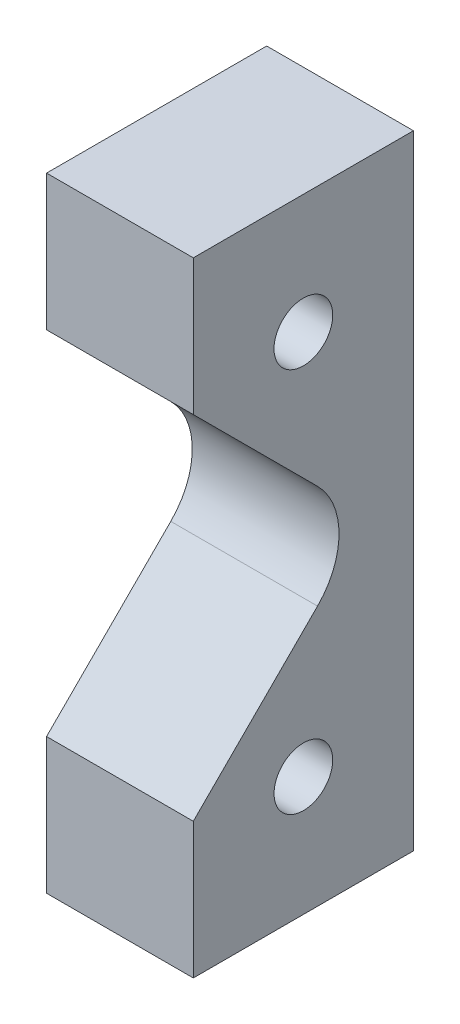
ISO-10303-21;
HEADER;
FILE_DESCRIPTION(('STEP AP214'),'2;1');
FILE_NAME('part.step','',(''),(''),'','','');
FILE_SCHEMA(('AUTOMOTIVE_DESIGN { 1 0 10303 214 1 1 1 1 }'));
ENDSEC;
DATA;
#1=APPLICATION_CONTEXT('core data for automotive mechanical design processes');
#2=APPLICATION_PROTOCOL_DEFINITION('international standard','automotive_design',2000,#1);
#3=PRODUCT_CONTEXT('',#1,'mechanical');
#4=PRODUCT('Part','Part','',(#3));
#5=PRODUCT_RELATED_PRODUCT_CATEGORY('part','',(#4));
#6=PRODUCT_DEFINITION_FORMATION('','',#4);
#7=PRODUCT_DEFINITION_CONTEXT('part definition',#1,'design');
#8=PRODUCT_DEFINITION('design','',#6,#7);
#9=PRODUCT_DEFINITION_SHAPE('','',#8);
#10=(LENGTH_UNIT() NAMED_UNIT(*) SI_UNIT(.MILLI.,.METRE.));
#11=(NAMED_UNIT(*) PLANE_ANGLE_UNIT() SI_UNIT($,.RADIAN.));
#12=(NAMED_UNIT(*) SI_UNIT($,.STERADIAN.) SOLID_ANGLE_UNIT());
#13=UNCERTAINTY_MEASURE_WITH_UNIT(LENGTH_MEASURE(1.E-05),#10,'distance_accuracy_value','');
#14=(GEOMETRIC_REPRESENTATION_CONTEXT(3) GLOBAL_UNCERTAINTY_ASSIGNED_CONTEXT((#13)) GLOBAL_UNIT_ASSIGNED_CONTEXT((#10,
#11,#12)) REPRESENTATION_CONTEXT('',''));
#15=CARTESIAN_POINT('',(0.,0.,0.));
#16=DIRECTION('',(0.,0.,1.));
#17=DIRECTION('',(1.,0.,0.));
#18=AXIS2_PLACEMENT_3D('',#15,#16,#17);
#19=CARTESIAN_POINT('',(20.,24.,15.));
#20=DIRECTION('',(0.,0.,-1.));
#21=DIRECTION('',(0.,1.,0.));
#22=AXIS2_PLACEMENT_3D('',#19,#20,#21);
#23=PLANE('',#22);
#24=DIRECTION('',(0.,-1.,0.));
#25=VECTOR('',#24,1.);
#26=CARTESIAN_POINT('',(0.,24.,15.));
#27=LINE('',#26,#25);
#28=CARTESIAN_POINT('',(0.,42.5,15.));
#29=VERTEX_POINT('',#28);
#30=CARTESIAN_POINT('',(0.,24.,15.));
#31=VERTEX_POINT('',#30);
#32=EDGE_CURVE('E132',#29,#31,#27,.T.);
#33=ORIENTED_EDGE('',*,*,#32,.T.);
#34=DIRECTION('',(-1.,0.,0.));
#35=VECTOR('',#34,1.);
#36=CARTESIAN_POINT('',(20.,24.,15.));
#37=LINE('',#36,#35);
#38=CARTESIAN_POINT('',(20.,24.,15.));
#39=VERTEX_POINT('',#38);
#40=EDGE_CURVE('E11',#39,#31,#37,.T.);
#41=ORIENTED_EDGE('',*,*,#40,.F.);
#42=DIRECTION('',(0.,-1.,0.));
#43=VECTOR('',#42,1.);
#44=CARTESIAN_POINT('',(20.,24.,15.));
#45=LINE('',#44,#43);
#46=CARTESIAN_POINT('',(20.,42.5,15.));
#47=VERTEX_POINT('',#46);
#48=EDGE_CURVE('E147',#47,#39,#45,.T.);
#49=ORIENTED_EDGE('',*,*,#48,.F.);
#50=DIRECTION('',(-1.,0.,0.));
#51=VECTOR('',#50,1.);
#52=CARTESIAN_POINT('',(20.,42.5,15.));
#53=LINE('',#52,#51);
#54=EDGE_CURVE('E128',#47,#29,#53,.T.);
#55=ORIENTED_EDGE('',*,*,#54,.T.);
#56=EDGE_LOOP('',(#33,#41,#49,#55));
#57=FACE_BOUND('',#56,.T.);
#58=ADVANCED_FACE('F36',(#57),#23,.F.);
#59=CARTESIAN_POINT('',(20.,24.,15.));
#60=DIRECTION('',(0.,0.707106781186544,-0.707106781186551));
#61=DIRECTION('',(0.,0.707106781186551,0.707106781186544));
#62=AXIS2_PLACEMENT_3D('',#59,#60,#61);
#63=PLANE('',#62);
#64=DIRECTION('',(0.,-0.707106781186551,-0.707106781186544));
#65=VECTOR('',#64,1.);
#66=CARTESIAN_POINT('',(0.,24.,15.));
#67=LINE('',#66,#65);
#68=CARTESIAN_POINT('',(0.,7.07106781186531,-1.92893218813452));
#69=VERTEX_POINT('',#68);
#70=EDGE_CURVE('E135',#31,#69,#67,.T.);
#71=ORIENTED_EDGE('',*,*,#70,.T.);
#72=DIRECTION('',(-1.,0.,0.));
#73=VECTOR('',#72,1.);
#74=CARTESIAN_POINT('',(20.,7.07106781186531,-1.92893218813452));
#75=LINE('',#74,#73);
#76=CARTESIAN_POINT('',(20.,7.07106781186531,-1.92893218813452));
#77=VERTEX_POINT('',#76);
#78=EDGE_CURVE('E44',#77,#69,#75,.T.);
#79=ORIENTED_EDGE('',*,*,#78,.F.);
#80=DIRECTION('',(0.,-0.707106781186551,-0.707106781186544));
#81=VECTOR('',#80,1.);
#82=CARTESIAN_POINT('',(20.,24.,15.));
#83=LINE('',#82,#81);
#84=EDGE_CURVE('E95',#39,#77,#83,.T.);
#85=ORIENTED_EDGE('',*,*,#84,.F.);
#86=ORIENTED_EDGE('',*,*,#40,.T.);
#87=EDGE_LOOP('',(#71,#79,#85,#86));
#88=FACE_BOUND('',#87,.T.);
#89=ADVANCED_FACE('F214',(#88),#63,.F.);
#90=CARTESIAN_POINT('',(20.,-1.14214193658313E-13,5.142135623731));
#91=DIRECTION('',(-1.,0.,0.));
#92=DIRECTION('',(0.,0.,1.));
#93=AXIS2_PLACEMENT_3D('',#90,#91,#92);
#94=CYLINDRICAL_SURFACE('',#93,9.99999999999999);
#95=CARTESIAN_POINT('',(0.,-1.14214193658313E-13,5.142135623731));
#96=DIRECTION('',(-1.,0.,0.));
#97=DIRECTION('',(0.,0.,-1.));
#98=AXIS2_PLACEMENT_3D('',#95,#96,#97);
#99=CIRCLE('',#98,9.99999999999999);
#100=CARTESIAN_POINT('',(0.,-7.0710678118656,-1.92893218813446));
#101=VERTEX_POINT('',#100);
#102=EDGE_CURVE('E138',#69,#101,#99,.T.);
#103=ORIENTED_EDGE('',*,*,#102,.T.);
#104=DIRECTION('',(-1.,0.,0.));
#105=VECTOR('',#104,1.);
#106=CARTESIAN_POINT('',(20.,-7.0710678118656,-1.92893218813446));
#107=LINE('',#106,#105);
#108=CARTESIAN_POINT('',(20.,-7.0710678118656,-1.92893218813446));
#109=VERTEX_POINT('',#108);
#110=EDGE_CURVE('E154',#109,#101,#107,.T.);
#111=ORIENTED_EDGE('',*,*,#110,.F.);
#112=CARTESIAN_POINT('',(20.,-1.14214193658313E-13,5.142135623731));
#113=DIRECTION('',(-1.,0.,0.));
#114=DIRECTION('',(0.,0.,-1.));
#115=AXIS2_PLACEMENT_3D('',#112,#113,#114);
#116=CIRCLE('',#115,9.99999999999999);
#117=EDGE_CURVE('E162',#77,#109,#116,.T.);
#118=ORIENTED_EDGE('',*,*,#117,.F.);
#119=ORIENTED_EDGE('',*,*,#78,.T.);
#120=EDGE_LOOP('',(#103,#111,#118,#119));
#121=FACE_BOUND('',#120,.T.);
#122=ADVANCED_FACE('F160',(#121),#94,.F.);
#123=CARTESIAN_POINT('',(20.,-24.,15.));
#124=DIRECTION('',(0.,-0.707106781186549,-0.707106781186546));
#125=DIRECTION('',(0.,0.707106781186546,-0.707106781186549));
#126=AXIS2_PLACEMENT_3D('',#123,#124,#125);
#127=PLANE('',#126);
#128=DIRECTION('',(0.,-0.707106781186546,0.707106781186549));
#129=VECTOR('',#128,1.);
#130=CARTESIAN_POINT('',(0.,-24.,15.));
#131=LINE('',#130,#129);
#132=CARTESIAN_POINT('',(0.,-24.,15.));
#133=VERTEX_POINT('',#132);
#134=EDGE_CURVE('E140',#101,#133,#131,.T.);
#135=ORIENTED_EDGE('',*,*,#134,.T.);
#136=DIRECTION('',(-1.,0.,0.));
#137=VECTOR('',#136,1.);
#138=CARTESIAN_POINT('',(20.,-24.,15.));
#139=LINE('',#138,#137);
#140=CARTESIAN_POINT('',(20.,-24.,15.));
#141=VERTEX_POINT('',#140);
#142=EDGE_CURVE('E151',#141,#133,#139,.T.);
#143=ORIENTED_EDGE('',*,*,#142,.F.);
#144=DIRECTION('',(0.,-0.707106781186546,0.707106781186549));
#145=VECTOR('',#144,1.);
#146=CARTESIAN_POINT('',(20.,-24.,15.));
#147=LINE('',#146,#145);
#148=EDGE_CURVE('E174',#109,#141,#147,.T.);
#149=ORIENTED_EDGE('',*,*,#148,.F.);
#150=ORIENTED_EDGE('',*,*,#110,.T.);
#151=EDGE_LOOP('',(#135,#143,#149,#150));
#152=FACE_BOUND('',#151,.T.);
#153=ADVANCED_FACE('F170',(#152),#127,.F.);
#154=CARTESIAN_POINT('',(20.,-42.5,15.));
#155=DIRECTION('',(0.,0.,-1.));
#156=DIRECTION('',(0.,1.,0.));
#157=AXIS2_PLACEMENT_3D('',#154,#155,#156);
#158=PLANE('',#157);
#159=DIRECTION('',(0.,-1.,0.));
#160=VECTOR('',#159,1.);
#161=CARTESIAN_POINT('',(0.,-42.5,15.));
#162=LINE('',#161,#160);
#163=CARTESIAN_POINT('',(0.,-42.5,15.));
#164=VERTEX_POINT('',#163);
#165=EDGE_CURVE('E142',#133,#164,#162,.T.);
#166=ORIENTED_EDGE('',*,*,#165,.T.);
#167=DIRECTION('',(-1.,0.,0.));
#168=VECTOR('',#167,1.);
#169=CARTESIAN_POINT('',(20.,-42.5,15.));
#170=LINE('',#169,#168);
#171=CARTESIAN_POINT('',(20.,-42.5,15.));
#172=VERTEX_POINT('',#171);
#173=EDGE_CURVE('E123',#172,#164,#170,.T.);
#174=ORIENTED_EDGE('',*,*,#173,.F.);
#175=DIRECTION('',(0.,-1.,0.));
#176=VECTOR('',#175,1.);
#177=CARTESIAN_POINT('',(20.,-42.5,15.));
#178=LINE('',#177,#176);
#179=EDGE_CURVE('E114',#141,#172,#178,.T.);
#180=ORIENTED_EDGE('',*,*,#179,.F.);
#181=ORIENTED_EDGE('',*,*,#142,.T.);
#182=EDGE_LOOP('',(#166,#174,#180,#181));
#183=FACE_BOUND('',#182,.T.);
#184=ADVANCED_FACE('F173',(#183),#158,.F.);
#185=CARTESIAN_POINT('',(20.,-42.5,-15.));
#186=DIRECTION('',(0.,1.,0.));
#187=DIRECTION('',(0.,0.,1.));
#188=AXIS2_PLACEMENT_3D('',#185,#186,#187);
#189=PLANE('',#188);
#190=DIRECTION('',(0.,0.,-1.));
#191=VECTOR('',#190,1.);
#192=CARTESIAN_POINT('',(0.,-42.5,-15.));
#193=LINE('',#192,#191);
#194=CARTESIAN_POINT('',(0.,-42.5,-15.));
#195=VERTEX_POINT('',#194);
#196=EDGE_CURVE('E122',#164,#195,#193,.T.);
#197=ORIENTED_EDGE('',*,*,#196,.T.);
#198=DIRECTION('',(-1.,0.,0.));
#199=VECTOR('',#198,1.);
#200=CARTESIAN_POINT('',(20.,-42.5,-15.));
#201=LINE('',#200,#199);
#202=CARTESIAN_POINT('',(20.,-42.5,-15.));
#203=VERTEX_POINT('',#202);
#204=EDGE_CURVE('E119',#203,#195,#201,.T.);
#205=ORIENTED_EDGE('',*,*,#204,.F.);
#206=DIRECTION('',(0.,0.,-1.));
#207=VECTOR('',#206,1.);
#208=CARTESIAN_POINT('',(20.,-42.5,-15.));
#209=LINE('',#208,#207);
#210=EDGE_CURVE('E108',#172,#203,#209,.T.);
#211=ORIENTED_EDGE('',*,*,#210,.F.);
#212=ORIENTED_EDGE('',*,*,#173,.T.);
#213=EDGE_LOOP('',(#197,#205,#211,#212));
#214=FACE_BOUND('',#213,.T.);
#215=ADVANCED_FACE('F120',(#214),#189,.F.);
#216=CARTESIAN_POINT('',(20.,-42.5,-15.));
#217=DIRECTION('',(0.,0.,1.));
#218=DIRECTION('',(1.,0.,0.));
#219=AXIS2_PLACEMENT_3D('',#216,#217,#218);
#220=PLANE('',#219);
#221=DIRECTION('',(0.,1.,0.));
#222=VECTOR('',#221,1.);
#223=CARTESIAN_POINT('',(0.,-42.5,-15.));
#224=LINE('',#223,#222);
#225=CARTESIAN_POINT('',(0.,42.5,-15.));
#226=VERTEX_POINT('',#225);
#227=EDGE_CURVE('E81',#195,#226,#224,.T.);
#228=ORIENTED_EDGE('',*,*,#227,.T.);
#229=DIRECTION('',(-1.,0.,0.));
#230=VECTOR('',#229,1.);
#231=CARTESIAN_POINT('',(20.,42.5,-15.));
#232=LINE('',#231,#230);
#233=CARTESIAN_POINT('',(20.,42.5,-15.));
#234=VERTEX_POINT('',#233);
#235=EDGE_CURVE('E124',#234,#226,#232,.T.);
#236=ORIENTED_EDGE('',*,*,#235,.F.);
#237=DIRECTION('',(0.,1.,0.));
#238=VECTOR('',#237,1.);
#239=CARTESIAN_POINT('',(20.,-42.5,-15.));
#240=LINE('',#239,#238);
#241=EDGE_CURVE('E112',#203,#234,#240,.T.);
#242=ORIENTED_EDGE('',*,*,#241,.F.);
#243=ORIENTED_EDGE('',*,*,#204,.T.);
#244=EDGE_LOOP('',(#228,#236,#242,#243));
#245=FACE_BOUND('',#244,.T.);
#246=ADVANCED_FACE('F126',(#245),#220,.F.);
#247=CARTESIAN_POINT('',(20.,42.5,-15.));
#248=DIRECTION('',(0.,-1.,0.));
#249=DIRECTION('',(0.,0.,-1.));
#250=AXIS2_PLACEMENT_3D('',#247,#248,#249);
#251=PLANE('',#250);
#252=DIRECTION('',(0.,0.,1.));
#253=VECTOR('',#252,1.);
#254=CARTESIAN_POINT('',(0.,42.5,-15.));
#255=LINE('',#254,#253);
#256=EDGE_CURVE('E87',#226,#29,#255,.T.);
#257=ORIENTED_EDGE('',*,*,#256,.T.);
#258=ORIENTED_EDGE('',*,*,#54,.F.);
#259=DIRECTION('',(0.,0.,1.));
#260=VECTOR('',#259,1.);
#261=CARTESIAN_POINT('',(20.,42.5,-15.));
#262=LINE('',#261,#260);
#263=EDGE_CURVE('E52',#234,#47,#262,.T.);
#264=ORIENTED_EDGE('',*,*,#263,.F.);
#265=ORIENTED_EDGE('',*,*,#235,.T.);
#266=EDGE_LOOP('',(#257,#258,#264,#265));
#267=FACE_BOUND('',#266,.T.);
#268=ADVANCED_FACE('F221',(#267),#251,.F.);
#269=CARTESIAN_POINT('',(20.,-1.14214193658313E-13,5.142135623731));
#270=DIRECTION('',(1.,0.,0.));
#271=DIRECTION('',(0.,0.,-1.));
#272=AXIS2_PLACEMENT_3D('',#269,#270,#271);
#273=PLANE('',#272);
#274=CARTESIAN_POINT('',(20.,-26.25,0.));
#275=DIRECTION('',(-1.,0.,0.));
#276=DIRECTION('',(0.,0.,-1.));
#277=AXIS2_PLACEMENT_3D('',#274,#275,#276);
#278=CIRCLE('',#277,4.);
#279=CARTESIAN_POINT('',(20.,-26.25,-4.));
#280=VERTEX_POINT('',#279);
#281=EDGE_CURVE('E183',#280,#280,#278,.T.);
#282=ORIENTED_EDGE('',*,*,#281,.T.);
#283=EDGE_LOOP('',(#282));
#284=FACE_BOUND('',#283,.T.);
#285=CARTESIAN_POINT('',(20.,26.25,0.));
#286=DIRECTION('',(-1.,0.,0.));
#287=DIRECTION('',(0.,0.,1.));
#288=AXIS2_PLACEMENT_3D('',#285,#286,#287);
#289=CIRCLE('',#288,4.);
#290=CARTESIAN_POINT('',(20.,26.25,4.));
#291=VERTEX_POINT('',#290);
#292=EDGE_CURVE('E136',#291,#291,#289,.T.);
#293=ORIENTED_EDGE('',*,*,#292,.T.);
#294=EDGE_LOOP('',(#293));
#295=FACE_BOUND('',#294,.T.);
#296=ORIENTED_EDGE('',*,*,#48,.T.);
#297=ORIENTED_EDGE('',*,*,#84,.T.);
#298=ORIENTED_EDGE('',*,*,#117,.T.);
#299=ORIENTED_EDGE('',*,*,#148,.T.);
#300=ORIENTED_EDGE('',*,*,#179,.T.);
#301=ORIENTED_EDGE('',*,*,#210,.T.);
#302=ORIENTED_EDGE('',*,*,#241,.T.);
#303=ORIENTED_EDGE('',*,*,#263,.T.);
#304=EDGE_LOOP('',(#296,#297,#298,#299,#300,#301,#302,#303));
#305=FACE_BOUND('',#304,.T.);
#306=ADVANCED_FACE('F110',(#284,#295,#305),#273,.T.);
#307=CARTESIAN_POINT('',(0.,-1.14214193658313E-13,5.142135623731));
#308=DIRECTION('',(1.,0.,0.));
#309=DIRECTION('',(0.,0.,-1.));
#310=AXIS2_PLACEMENT_3D('',#307,#308,#309);
#311=PLANE('',#310);
#312=CARTESIAN_POINT('',(0.,-26.25,0.));
#313=DIRECTION('',(-1.,0.,0.));
#314=DIRECTION('',(0.,0.,-1.));
#315=AXIS2_PLACEMENT_3D('',#312,#313,#314);
#316=CIRCLE('',#315,4.);
#317=CARTESIAN_POINT('',(0.,-26.25,-4.));
#318=VERTEX_POINT('',#317);
#319=EDGE_CURVE('E186',#318,#318,#316,.T.);
#320=ORIENTED_EDGE('',*,*,#319,.F.);
#321=EDGE_LOOP('',(#320));
#322=FACE_BOUND('',#321,.T.);
#323=CARTESIAN_POINT('',(0.,26.25,0.));
#324=DIRECTION('',(-1.,0.,0.));
#325=DIRECTION('',(0.,0.,1.));
#326=AXIS2_PLACEMENT_3D('',#323,#324,#325);
#327=CIRCLE('',#326,4.);
#328=CARTESIAN_POINT('',(0.,26.25,4.));
#329=VERTEX_POINT('',#328);
#330=EDGE_CURVE('E180',#329,#329,#327,.T.);
#331=ORIENTED_EDGE('',*,*,#330,.F.);
#332=EDGE_LOOP('',(#331));
#333=FACE_BOUND('',#332,.T.);
#334=ORIENTED_EDGE('',*,*,#32,.F.);
#335=ORIENTED_EDGE('',*,*,#256,.F.);
#336=ORIENTED_EDGE('',*,*,#227,.F.);
#337=ORIENTED_EDGE('',*,*,#196,.F.);
#338=ORIENTED_EDGE('',*,*,#165,.F.);
#339=ORIENTED_EDGE('',*,*,#134,.F.);
#340=ORIENTED_EDGE('',*,*,#102,.F.);
#341=ORIENTED_EDGE('',*,*,#70,.F.);
#342=EDGE_LOOP('',(#334,#335,#336,#337,#338,#339,#340,#341));
#343=FACE_BOUND('',#342,.T.);
#344=ADVANCED_FACE('F166',(#322,#333,#343),#311,.F.);
#345=CARTESIAN_POINT('',(20.,26.25,0.));
#346=DIRECTION('',(-1.,0.,0.));
#347=DIRECTION('',(0.,0.,1.));
#348=AXIS2_PLACEMENT_3D('',#345,#346,#347);
#349=CYLINDRICAL_SURFACE('',#348,4.);
#350=ORIENTED_EDGE('',*,*,#292,.F.);
#351=EDGE_LOOP('',(#350));
#352=FACE_BOUND('',#351,.T.);
#353=ORIENTED_EDGE('',*,*,#330,.T.);
#354=EDGE_LOOP('',(#353));
#355=FACE_BOUND('',#354,.T.);
#356=ADVANCED_FACE('F197',(#352,#355),#349,.F.);
#357=CARTESIAN_POINT('',(20.,-26.25,0.));
#358=DIRECTION('',(-1.,0.,0.));
#359=DIRECTION('',(0.,0.,1.));
#360=AXIS2_PLACEMENT_3D('',#357,#358,#359);
#361=CYLINDRICAL_SURFACE('',#360,4.);
#362=ORIENTED_EDGE('',*,*,#281,.F.);
#363=EDGE_LOOP('',(#362));
#364=FACE_BOUND('',#363,.T.);
#365=ORIENTED_EDGE('',*,*,#319,.T.);
#366=EDGE_LOOP('',(#365));
#367=FACE_BOUND('',#366,.T.);
#368=ADVANCED_FACE('F194',(#364,#367),#361,.F.);
#369=CLOSED_SHELL('',(#58,#89,#122,#153,#184,#215,#246,#268,#306,#344,#356,#368));
#370=MANIFOLD_SOLID_BREP('B2',#369);
#371=ADVANCED_BREP_SHAPE_REPRESENTATION('',(#18,#370),#14);
#372=SHAPE_DEFINITION_REPRESENTATION(#9,#371);
ENDSEC;
END-ISO-10303-21;
